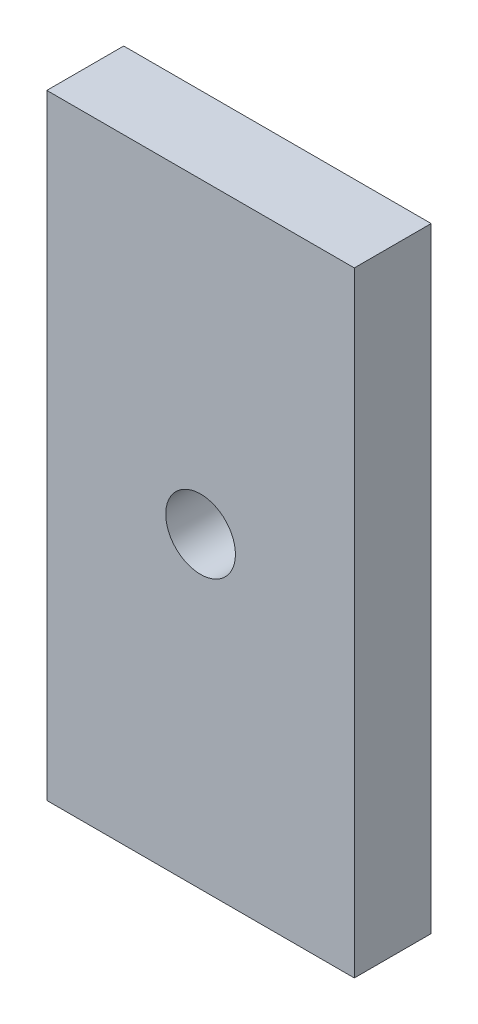
ISO-10303-21;
HEADER;
FILE_DESCRIPTION(('STEP AP214'),'2;1');
FILE_NAME('part.step','',(''),(''),'','','');
FILE_SCHEMA(('AUTOMOTIVE_DESIGN { 1 0 10303 214 1 1 1 1 }'));
ENDSEC;
DATA;
#1=APPLICATION_CONTEXT('core data for automotive mechanical design processes');
#2=APPLICATION_PROTOCOL_DEFINITION('international standard','automotive_design',2000,#1);
#3=PRODUCT_CONTEXT('',#1,'mechanical');
#4=PRODUCT('Part','Part','',(#3));
#5=PRODUCT_RELATED_PRODUCT_CATEGORY('part','',(#4));
#6=PRODUCT_DEFINITION_FORMATION('','',#4);
#7=PRODUCT_DEFINITION_CONTEXT('part definition',#1,'design');
#8=PRODUCT_DEFINITION('design','',#6,#7);
#9=PRODUCT_DEFINITION_SHAPE('','',#8);
#10=(LENGTH_UNIT() NAMED_UNIT(*) SI_UNIT(.MILLI.,.METRE.));
#11=(NAMED_UNIT(*) PLANE_ANGLE_UNIT() SI_UNIT($,.RADIAN.));
#12=(NAMED_UNIT(*) SI_UNIT($,.STERADIAN.) SOLID_ANGLE_UNIT());
#13=UNCERTAINTY_MEASURE_WITH_UNIT(LENGTH_MEASURE(1.E-05),#10,'distance_accuracy_value','');
#14=(GEOMETRIC_REPRESENTATION_CONTEXT(3) GLOBAL_UNCERTAINTY_ASSIGNED_CONTEXT((#13)) GLOBAL_UNIT_ASSIGNED_CONTEXT((#10,
#11,#12)) REPRESENTATION_CONTEXT('',''));
#15=CARTESIAN_POINT('',(0.,0.,0.));
#16=DIRECTION('',(0.,0.,1.));
#17=DIRECTION('',(1.,0.,0.));
#18=AXIS2_PLACEMENT_3D('',#15,#16,#17);
#19=CARTESIAN_POINT('',(-19.05,38.1,9.525));
#20=DIRECTION('',(0.,-1.,0.));
#21=DIRECTION('',(0.,0.,-1.));
#22=AXIS2_PLACEMENT_3D('',#19,#20,#21);
#23=PLANE('',#22);
#24=DIRECTION('',(-1.,0.,0.));
#25=VECTOR('',#24,1.);
#26=CARTESIAN_POINT('',(-19.05,38.1,0.));
#27=LINE('',#26,#25);
#28=CARTESIAN_POINT('',(19.05,38.1,0.));
#29=VERTEX_POINT('',#28);
#30=CARTESIAN_POINT('',(-19.05,38.1,0.));
#31=VERTEX_POINT('',#30);
#32=EDGE_CURVE('E107',#29,#31,#27,.T.);
#33=ORIENTED_EDGE('',*,*,#32,.T.);
#34=DIRECTION('',(0.,0.,-1.));
#35=VECTOR('',#34,1.);
#36=CARTESIAN_POINT('',(-19.05,38.1,9.525));
#37=LINE('',#36,#35);
#38=CARTESIAN_POINT('',(-19.05,38.1,9.525));
#39=VERTEX_POINT('',#38);
#40=EDGE_CURVE('E12',#39,#31,#37,.T.);
#41=ORIENTED_EDGE('',*,*,#40,.F.);
#42=DIRECTION('',(-1.,0.,0.));
#43=VECTOR('',#42,1.);
#44=CARTESIAN_POINT('',(-19.05,38.1,9.525));
#45=LINE('',#44,#43);
#46=CARTESIAN_POINT('',(19.05,38.1,9.525));
#47=VERTEX_POINT('',#46);
#48=EDGE_CURVE('E94',#47,#39,#45,.T.);
#49=ORIENTED_EDGE('',*,*,#48,.F.);
#50=DIRECTION('',(0.,0.,-1.));
#51=VECTOR('',#50,1.);
#52=CARTESIAN_POINT('',(19.05,38.1,9.525));
#53=LINE('',#52,#51);
#54=EDGE_CURVE('E103',#47,#29,#53,.T.);
#55=ORIENTED_EDGE('',*,*,#54,.T.);
#56=EDGE_LOOP('',(#33,#41,#49,#55));
#57=FACE_BOUND('',#56,.T.);
#58=ADVANCED_FACE('F42',(#57),#23,.F.);
#59=CARTESIAN_POINT('',(-19.05,38.1,9.525));
#60=DIRECTION('',(1.,0.,0.));
#61=DIRECTION('',(0.,1.,0.));
#62=AXIS2_PLACEMENT_3D('',#59,#60,#61);
#63=PLANE('',#62);
#64=DIRECTION('',(0.,-1.,0.));
#65=VECTOR('',#64,1.);
#66=CARTESIAN_POINT('',(-19.05,38.1,0.));
#67=LINE('',#66,#65);
#68=CARTESIAN_POINT('',(-19.05,-38.1,0.));
#69=VERTEX_POINT('',#68);
#70=EDGE_CURVE('E98',#31,#69,#67,.T.);
#71=ORIENTED_EDGE('',*,*,#70,.T.);
#72=DIRECTION('',(0.,0.,-1.));
#73=VECTOR('',#72,1.);
#74=CARTESIAN_POINT('',(-19.05,-38.1,9.525));
#75=LINE('',#74,#73);
#76=CARTESIAN_POINT('',(-19.05,-38.1,9.525));
#77=VERTEX_POINT('',#76);
#78=EDGE_CURVE('E51',#77,#69,#75,.T.);
#79=ORIENTED_EDGE('',*,*,#78,.F.);
#80=DIRECTION('',(0.,-1.,0.));
#81=VECTOR('',#80,1.);
#82=CARTESIAN_POINT('',(-19.05,38.1,9.525));
#83=LINE('',#82,#81);
#84=EDGE_CURVE('E89',#39,#77,#83,.T.);
#85=ORIENTED_EDGE('',*,*,#84,.F.);
#86=ORIENTED_EDGE('',*,*,#40,.T.);
#87=EDGE_LOOP('',(#71,#79,#85,#86));
#88=FACE_BOUND('',#87,.T.);
#89=ADVANCED_FACE('F97',(#88),#63,.F.);
#90=CARTESIAN_POINT('',(-19.05,-38.1,9.525));
#91=DIRECTION('',(0.,1.,0.));
#92=DIRECTION('',(0.,0.,1.));
#93=AXIS2_PLACEMENT_3D('',#90,#91,#92);
#94=PLANE('',#93);
#95=DIRECTION('',(1.,0.,0.));
#96=VECTOR('',#95,1.);
#97=CARTESIAN_POINT('',(-19.05,-38.1,0.));
#98=LINE('',#97,#96);
#99=CARTESIAN_POINT('',(19.05,-38.1,0.));
#100=VERTEX_POINT('',#99);
#101=EDGE_CURVE('E76',#69,#100,#98,.T.);
#102=ORIENTED_EDGE('',*,*,#101,.T.);
#103=DIRECTION('',(0.,0.,-1.));
#104=VECTOR('',#103,1.);
#105=CARTESIAN_POINT('',(19.05,-38.1,9.525));
#106=LINE('',#105,#104);
#107=CARTESIAN_POINT('',(19.05,-38.1,9.525));
#108=VERTEX_POINT('',#107);
#109=EDGE_CURVE('E99',#108,#100,#106,.T.);
#110=ORIENTED_EDGE('',*,*,#109,.F.);
#111=DIRECTION('',(1.,0.,0.));
#112=VECTOR('',#111,1.);
#113=CARTESIAN_POINT('',(-19.05,-38.1,9.525));
#114=LINE('',#113,#112);
#115=EDGE_CURVE('E92',#77,#108,#114,.T.);
#116=ORIENTED_EDGE('',*,*,#115,.F.);
#117=ORIENTED_EDGE('',*,*,#78,.T.);
#118=EDGE_LOOP('',(#102,#110,#116,#117));
#119=FACE_BOUND('',#118,.T.);
#120=ADVANCED_FACE('F101',(#119),#94,.F.);
#121=CARTESIAN_POINT('',(19.05,38.1,9.525));
#122=DIRECTION('',(-1.,0.,0.));
#123=DIRECTION('',(0.,-1.,0.));
#124=AXIS2_PLACEMENT_3D('',#121,#122,#123);
#125=PLANE('',#124);
#126=DIRECTION('',(0.,1.,0.));
#127=VECTOR('',#126,1.);
#128=CARTESIAN_POINT('',(19.05,38.1,0.));
#129=LINE('',#128,#127);
#130=EDGE_CURVE('E82',#100,#29,#129,.T.);
#131=ORIENTED_EDGE('',*,*,#130,.T.);
#132=ORIENTED_EDGE('',*,*,#54,.F.);
#133=DIRECTION('',(0.,1.,0.));
#134=VECTOR('',#133,1.);
#135=CARTESIAN_POINT('',(19.05,38.1,9.525));
#136=LINE('',#135,#134);
#137=EDGE_CURVE('E59',#108,#47,#136,.T.);
#138=ORIENTED_EDGE('',*,*,#137,.F.);
#139=ORIENTED_EDGE('',*,*,#109,.T.);
#140=EDGE_LOOP('',(#131,#132,#138,#139));
#141=FACE_BOUND('',#140,.T.);
#142=ADVANCED_FACE('F114',(#141),#125,.F.);
#143=CARTESIAN_POINT('',(0.,0.,9.525));
#144=DIRECTION('',(0.,0.,-1.));
#145=DIRECTION('',(-1.,0.,0.));
#146=AXIS2_PLACEMENT_3D('',#143,#144,#145);
#147=PLANE('',#146);
#148=CARTESIAN_POINT('',(0.,0.,9.525));
#149=DIRECTION('',(0.,0.,1.));
#150=DIRECTION('',(1.,0.,0.));
#151=AXIS2_PLACEMENT_3D('',#148,#149,#150);
#152=CIRCLE('',#151,4.318);
#153=CARTESIAN_POINT('',(4.318,0.,9.525));
#154=VERTEX_POINT('',#153);
#155=EDGE_CURVE('E120',#154,#154,#152,.T.);
#156=ORIENTED_EDGE('',*,*,#155,.F.);
#157=EDGE_LOOP('',(#156));
#158=FACE_BOUND('',#157,.T.);
#159=ORIENTED_EDGE('',*,*,#48,.T.);
#160=ORIENTED_EDGE('',*,*,#84,.T.);
#161=ORIENTED_EDGE('',*,*,#115,.T.);
#162=ORIENTED_EDGE('',*,*,#137,.T.);
#163=EDGE_LOOP('',(#159,#160,#161,#162));
#164=FACE_BOUND('',#163,.T.);
#165=ADVANCED_FACE('F90',(#158,#164),#147,.F.);
#166=CARTESIAN_POINT('',(0.,0.,0.));
#167=DIRECTION('',(0.,0.,-1.));
#168=DIRECTION('',(-1.,0.,0.));
#169=AXIS2_PLACEMENT_3D('',#166,#167,#168);
#170=PLANE('',#169);
#171=CARTESIAN_POINT('',(0.,0.,0.));
#172=DIRECTION('',(0.,0.,-1.));
#173=DIRECTION('',(-1.,0.,0.));
#174=AXIS2_PLACEMENT_3D('',#171,#172,#173);
#175=CIRCLE('',#174,4.318);
#176=CARTESIAN_POINT('',(-4.318,0.,0.));
#177=VERTEX_POINT('',#176);
#178=EDGE_CURVE('E45',#177,#177,#175,.T.);
#179=ORIENTED_EDGE('',*,*,#178,.F.);
#180=EDGE_LOOP('',(#179));
#181=FACE_BOUND('',#180,.T.);
#182=ORIENTED_EDGE('',*,*,#32,.F.);
#183=ORIENTED_EDGE('',*,*,#130,.F.);
#184=ORIENTED_EDGE('',*,*,#101,.F.);
#185=ORIENTED_EDGE('',*,*,#70,.F.);
#186=EDGE_LOOP('',(#182,#183,#184,#185));
#187=FACE_BOUND('',#186,.T.);
#188=ADVANCED_FACE('F117',(#181,#187),#170,.T.);
#189=CARTESIAN_POINT('',(0.,0.,-3.175));
#190=DIRECTION('',(0.,0.,1.));
#191=DIRECTION('',(1.,0.,0.));
#192=AXIS2_PLACEMENT_3D('',#189,#190,#191);
#193=CYLINDRICAL_SURFACE('',#192,4.318);
#194=ORIENTED_EDGE('',*,*,#178,.T.);
#195=EDGE_LOOP('',(#194));
#196=FACE_BOUND('',#195,.T.);
#197=ORIENTED_EDGE('',*,*,#155,.T.);
#198=EDGE_LOOP('',(#197));
#199=FACE_BOUND('',#198,.T.);
#200=ADVANCED_FACE('F127',(#196,#199),#193,.F.);
#201=CLOSED_SHELL('',(#58,#89,#120,#142,#165,#188,#200));
#202=MANIFOLD_SOLID_BREP('B2',#201);
#203=ADVANCED_BREP_SHAPE_REPRESENTATION('',(#18,#202),#14);
#204=SHAPE_DEFINITION_REPRESENTATION(#9,#203);
ENDSEC;
END-ISO-10303-21;
